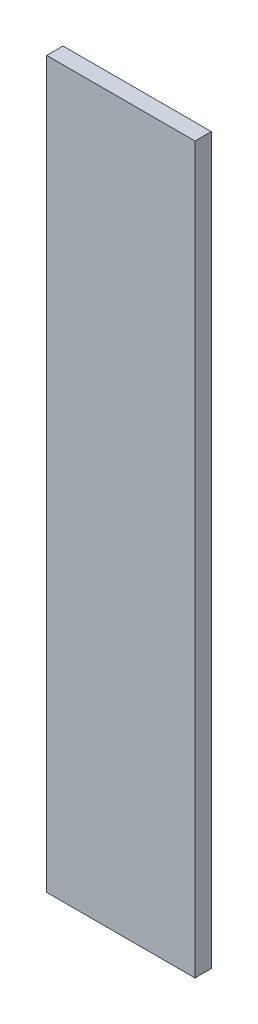
ISO-10303-21;
HEADER;
FILE_DESCRIPTION(('STEP AP214'),'2;1');
FILE_NAME('part.step','',(''),(''),'','','');
FILE_SCHEMA(('AUTOMOTIVE_DESIGN { 1 0 10303 214 1 1 1 1 }'));
ENDSEC;
DATA;
#1=APPLICATION_CONTEXT('core data for automotive mechanical design processes');
#2=APPLICATION_PROTOCOL_DEFINITION('international standard','automotive_design',2000,#1);
#3=PRODUCT_CONTEXT('',#1,'mechanical');
#4=PRODUCT('Part','Part','',(#3));
#5=PRODUCT_RELATED_PRODUCT_CATEGORY('part','',(#4));
#6=PRODUCT_DEFINITION_FORMATION('','',#4);
#7=PRODUCT_DEFINITION_CONTEXT('part definition',#1,'design');
#8=PRODUCT_DEFINITION('design','',#6,#7);
#9=PRODUCT_DEFINITION_SHAPE('','',#8);
#10=(LENGTH_UNIT() NAMED_UNIT(*) SI_UNIT(.MILLI.,.METRE.));
#11=(NAMED_UNIT(*) PLANE_ANGLE_UNIT() SI_UNIT($,.RADIAN.));
#12=(NAMED_UNIT(*) SI_UNIT($,.STERADIAN.) SOLID_ANGLE_UNIT());
#13=UNCERTAINTY_MEASURE_WITH_UNIT(LENGTH_MEASURE(1.E-05),#10,'distance_accuracy_value','');
#14=(GEOMETRIC_REPRESENTATION_CONTEXT(3) GLOBAL_UNCERTAINTY_ASSIGNED_CONTEXT((#13)) GLOBAL_UNIT_ASSIGNED_CONTEXT((#10,
#11,#12)) REPRESENTATION_CONTEXT('',''));
#15=CARTESIAN_POINT('',(0.,0.,0.));
#16=DIRECTION('',(0.,0.,1.));
#17=DIRECTION('',(1.,0.,0.));
#18=AXIS2_PLACEMENT_3D('',#15,#16,#17);
#19=CARTESIAN_POINT('',(-200.01,-0.00999999999997669,11.));
#20=DIRECTION('',(0.,0.,1.));
#21=DIRECTION('',(1.,0.,0.));
#22=AXIS2_PLACEMENT_3D('',#19,#20,#21);
#23=PLANE('',#22);
#24=DIRECTION('',(1.,0.,0.));
#25=VECTOR('',#24,1.);
#26=CARTESIAN_POINT('',(-100.,978.,11.));
#27=LINE('',#26,#25);
#28=CARTESIAN_POINT('',(-200.,978.,11.));
#29=VERTEX_POINT('',#28);
#30=CARTESIAN_POINT('',(0.,978.,11.));
#31=VERTEX_POINT('',#30);
#32=EDGE_CURVE('E69',#29,#31,#27,.T.);
#33=ORIENTED_EDGE('',*,*,#32,.F.);
#34=DIRECTION('',(0.,1.,0.));
#35=VECTOR('',#34,1.);
#36=CARTESIAN_POINT('',(-200.,489.,11.));
#37=LINE('',#36,#35);
#38=CARTESIAN_POINT('',(-200.,0.,11.));
#39=VERTEX_POINT('',#38);
#40=EDGE_CURVE('E56',#39,#29,#37,.T.);
#41=ORIENTED_EDGE('',*,*,#40,.F.);
#42=DIRECTION('',(-1.,0.,0.));
#43=VECTOR('',#42,1.);
#44=CARTESIAN_POINT('',(-100.,0.,11.));
#45=LINE('',#44,#43);
#46=CARTESIAN_POINT('',(0.,0.,11.));
#47=VERTEX_POINT('',#46);
#48=EDGE_CURVE('E21',#47,#39,#45,.T.);
#49=ORIENTED_EDGE('',*,*,#48,.F.);
#50=DIRECTION('',(0.,-1.,0.));
#51=VECTOR('',#50,1.);
#52=CARTESIAN_POINT('',(0.,489.,11.));
#53=LINE('',#52,#51);
#54=EDGE_CURVE('E81',#31,#47,#53,.T.);
#55=ORIENTED_EDGE('',*,*,#54,.F.);
#56=EDGE_LOOP('',(#33,#41,#49,#55));
#57=FACE_BOUND('',#56,.T.);
#58=ADVANCED_FACE('F17',(#57),#23,.T.);
#59=CARTESIAN_POINT('',(-200.01,0.,-11.01));
#60=DIRECTION('',(0.,-1.,0.));
#61=DIRECTION('',(1.,0.,0.));
#62=AXIS2_PLACEMENT_3D('',#59,#60,#61);
#63=PLANE('',#62);
#64=DIRECTION('',(0.,0.,1.));
#65=VECTOR('',#64,1.);
#66=CARTESIAN_POINT('',(-200.,0.,0.));
#67=LINE('',#66,#65);
#68=CARTESIAN_POINT('',(-200.,0.,-11.));
#69=VERTEX_POINT('',#68);
#70=EDGE_CURVE('E62',#69,#39,#67,.T.);
#71=ORIENTED_EDGE('',*,*,#70,.F.);
#72=DIRECTION('',(-1.,0.,0.));
#73=VECTOR('',#72,1.);
#74=CARTESIAN_POINT('',(-100.,0.,-11.));
#75=LINE('',#74,#73);
#76=CARTESIAN_POINT('',(0.,0.,-11.));
#77=VERTEX_POINT('',#76);
#78=EDGE_CURVE('E84',#77,#69,#75,.T.);
#79=ORIENTED_EDGE('',*,*,#78,.F.);
#80=DIRECTION('',(0.,0.,-1.));
#81=VECTOR('',#80,1.);
#82=CARTESIAN_POINT('',(0.,0.,0.));
#83=LINE('',#82,#81);
#84=EDGE_CURVE('E65',#47,#77,#83,.T.);
#85=ORIENTED_EDGE('',*,*,#84,.F.);
#86=ORIENTED_EDGE('',*,*,#48,.T.);
#87=EDGE_LOOP('',(#71,#79,#85,#86));
#88=FACE_BOUND('',#87,.T.);
#89=ADVANCED_FACE('F61',(#88),#63,.T.);
#90=CARTESIAN_POINT('',(-200.,978.01,-11.01));
#91=DIRECTION('',(-1.,0.,0.));
#92=DIRECTION('',(0.,-1.,0.));
#93=AXIS2_PLACEMENT_3D('',#90,#91,#92);
#94=PLANE('',#93);
#95=DIRECTION('',(0.,0.,1.));
#96=VECTOR('',#95,1.);
#97=CARTESIAN_POINT('',(-200.,978.,0.));
#98=LINE('',#97,#96);
#99=CARTESIAN_POINT('',(-200.,978.,-11.));
#100=VERTEX_POINT('',#99);
#101=EDGE_CURVE('E71',#100,#29,#98,.T.);
#102=ORIENTED_EDGE('',*,*,#101,.F.);
#103=DIRECTION('',(0.,1.,0.));
#104=VECTOR('',#103,1.);
#105=CARTESIAN_POINT('',(-200.,489.,-11.));
#106=LINE('',#105,#104);
#107=EDGE_CURVE('E75',#69,#100,#106,.T.);
#108=ORIENTED_EDGE('',*,*,#107,.F.);
#109=ORIENTED_EDGE('',*,*,#70,.T.);
#110=ORIENTED_EDGE('',*,*,#40,.T.);
#111=EDGE_LOOP('',(#102,#108,#109,#110));
#112=FACE_BOUND('',#111,.T.);
#113=ADVANCED_FACE('F73',(#112),#94,.T.);
#114=CARTESIAN_POINT('',(0.01,978.,-11.01));
#115=DIRECTION('',(0.,1.,0.));
#116=DIRECTION('',(-1.,0.,0.));
#117=AXIS2_PLACEMENT_3D('',#114,#115,#116);
#118=PLANE('',#117);
#119=DIRECTION('',(0.,0.,1.));
#120=VECTOR('',#119,1.);
#121=CARTESIAN_POINT('',(0.,978.,0.));
#122=LINE('',#121,#120);
#123=CARTESIAN_POINT('',(0.,978.,-11.));
#124=VERTEX_POINT('',#123);
#125=EDGE_CURVE('E36',#124,#31,#122,.T.);
#126=ORIENTED_EDGE('',*,*,#125,.F.);
#127=DIRECTION('',(1.,0.,0.));
#128=VECTOR('',#127,1.);
#129=CARTESIAN_POINT('',(-100.,978.,-11.));
#130=LINE('',#129,#128);
#131=EDGE_CURVE('E27',#100,#124,#130,.T.);
#132=ORIENTED_EDGE('',*,*,#131,.F.);
#133=ORIENTED_EDGE('',*,*,#101,.T.);
#134=ORIENTED_EDGE('',*,*,#32,.T.);
#135=EDGE_LOOP('',(#126,#132,#133,#134));
#136=FACE_BOUND('',#135,.T.);
#137=ADVANCED_FACE('F89',(#136),#118,.T.);
#138=CARTESIAN_POINT('',(0.,-0.01,-11.01));
#139=DIRECTION('',(1.,0.,0.));
#140=DIRECTION('',(0.,1.,0.));
#141=AXIS2_PLACEMENT_3D('',#138,#139,#140);
#142=PLANE('',#141);
#143=ORIENTED_EDGE('',*,*,#84,.T.);
#144=DIRECTION('',(0.,-1.,0.));
#145=VECTOR('',#144,1.);
#146=CARTESIAN_POINT('',(0.,489.,-11.));
#147=LINE('',#146,#145);
#148=EDGE_CURVE('E11',#124,#77,#147,.T.);
#149=ORIENTED_EDGE('',*,*,#148,.F.);
#150=ORIENTED_EDGE('',*,*,#125,.T.);
#151=ORIENTED_EDGE('',*,*,#54,.T.);
#152=EDGE_LOOP('',(#143,#149,#150,#151));
#153=FACE_BOUND('',#152,.T.);
#154=ADVANCED_FACE('F91',(#153),#142,.T.);
#155=CARTESIAN_POINT('',(0.00999999999999446,-0.00999999999997669,-11.));
#156=DIRECTION('',(0.,0.,-1.));
#157=DIRECTION('',(-1.,0.,0.));
#158=AXIS2_PLACEMENT_3D('',#155,#156,#157);
#159=PLANE('',#158);
#160=ORIENTED_EDGE('',*,*,#131,.T.);
#161=ORIENTED_EDGE('',*,*,#148,.T.);
#162=ORIENTED_EDGE('',*,*,#78,.T.);
#163=ORIENTED_EDGE('',*,*,#107,.T.);
#164=EDGE_LOOP('',(#160,#161,#162,#163));
#165=FACE_BOUND('',#164,.T.);
#166=ADVANCED_FACE('F19',(#165),#159,.T.);
#167=CLOSED_SHELL('',(#58,#89,#113,#137,#154,#166));
#168=MANIFOLD_SOLID_BREP('B1',#167);
#169=ADVANCED_BREP_SHAPE_REPRESENTATION('',(#18,#168),#14);
#170=SHAPE_DEFINITION_REPRESENTATION(#9,#169);
ENDSEC;
END-ISO-10303-21;
